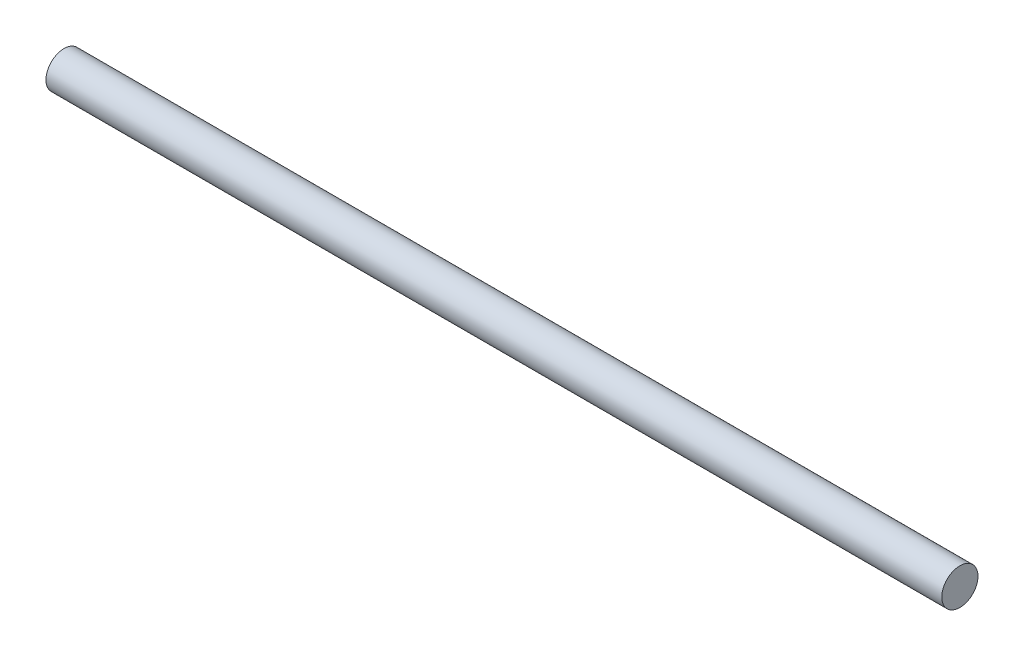
ISO-10303-21;
HEADER;
FILE_DESCRIPTION(('STEP AP214'),'2;1');
FILE_NAME('part.step','',(''),(''),'','','');
FILE_SCHEMA(('AUTOMOTIVE_DESIGN { 1 0 10303 214 1 1 1 1 }'));
ENDSEC;
DATA;
#1=APPLICATION_CONTEXT('core data for automotive mechanical design processes');
#2=APPLICATION_PROTOCOL_DEFINITION('international standard','automotive_design',2000,#1);
#3=PRODUCT_CONTEXT('',#1,'mechanical');
#4=PRODUCT('Part','Part','',(#3));
#5=PRODUCT_RELATED_PRODUCT_CATEGORY('part','',(#4));
#6=PRODUCT_DEFINITION_FORMATION('','',#4);
#7=PRODUCT_DEFINITION_CONTEXT('part definition',#1,'design');
#8=PRODUCT_DEFINITION('design','',#6,#7);
#9=PRODUCT_DEFINITION_SHAPE('','',#8);
#10=(LENGTH_UNIT() NAMED_UNIT(*) SI_UNIT(.MILLI.,.METRE.));
#11=(NAMED_UNIT(*) PLANE_ANGLE_UNIT() SI_UNIT($,.RADIAN.));
#12=(NAMED_UNIT(*) SI_UNIT($,.STERADIAN.) SOLID_ANGLE_UNIT());
#13=UNCERTAINTY_MEASURE_WITH_UNIT(LENGTH_MEASURE(1.E-05),#10,'distance_accuracy_value','');
#14=(GEOMETRIC_REPRESENTATION_CONTEXT(3) GLOBAL_UNCERTAINTY_ASSIGNED_CONTEXT((#13)) GLOBAL_UNIT_ASSIGNED_CONTEXT((#10,
#11,#12)) REPRESENTATION_CONTEXT('',''));
#15=CARTESIAN_POINT('',(0.,0.,0.));
#16=DIRECTION('',(0.,0.,1.));
#17=DIRECTION('',(1.,0.,0.));
#18=AXIS2_PLACEMENT_3D('',#15,#16,#17);
#19=CARTESIAN_POINT('',(14.45,0.,0.));
#20=DIRECTION('',(-1.,0.,0.));
#21=DIRECTION('',(0.,0.,1.));
#22=AXIS2_PLACEMENT_3D('',#19,#20,#21);
#23=CYLINDRICAL_SURFACE('',#22,0.2921);
#24=CARTESIAN_POINT('',(14.45,0.,0.));
#25=DIRECTION('',(1.,0.,0.));
#26=DIRECTION('',(0.,0.,-1.));
#27=AXIS2_PLACEMENT_3D('',#24,#25,#26);
#28=CIRCLE('',#27,0.2921);
#29=CARTESIAN_POINT('',(14.45,0.,-0.2921));
#30=VERTEX_POINT('',#29);
#31=EDGE_CURVE('E10',#30,#30,#28,.T.);
#32=ORIENTED_EDGE('',*,*,#31,.F.);
#33=EDGE_LOOP('',(#32));
#34=FACE_BOUND('',#33,.T.);
#35=CARTESIAN_POINT('',(0.,0.,0.));
#36=DIRECTION('',(1.,0.,0.));
#37=DIRECTION('',(0.,0.,-1.));
#38=AXIS2_PLACEMENT_3D('',#35,#36,#37);
#39=CIRCLE('',#38,0.2921);
#40=CARTESIAN_POINT('',(0.,0.,-0.2921));
#41=VERTEX_POINT('',#40);
#42=EDGE_CURVE('E34',#41,#41,#39,.T.);
#43=ORIENTED_EDGE('',*,*,#42,.T.);
#44=EDGE_LOOP('',(#43));
#45=FACE_BOUND('',#44,.T.);
#46=ADVANCED_FACE('F31',(#34,#45),#23,.T.);
#47=CARTESIAN_POINT('',(14.45,0.,0.));
#48=DIRECTION('',(1.,0.,0.));
#49=DIRECTION('',(0.,0.,-1.));
#50=AXIS2_PLACEMENT_3D('',#47,#48,#49);
#51=PLANE('',#50);
#52=ORIENTED_EDGE('',*,*,#31,.T.);
#53=EDGE_LOOP('',(#52));
#54=FACE_BOUND('',#53,.T.);
#55=ADVANCED_FACE('F46',(#54),#51,.T.);
#56=CARTESIAN_POINT('',(0.,0.,0.));
#57=DIRECTION('',(1.,0.,0.));
#58=DIRECTION('',(0.,0.,-1.));
#59=AXIS2_PLACEMENT_3D('',#56,#57,#58);
#60=PLANE('',#59);
#61=ORIENTED_EDGE('',*,*,#42,.F.);
#62=EDGE_LOOP('',(#61));
#63=FACE_BOUND('',#62,.T.);
#64=ADVANCED_FACE('F44',(#63),#60,.F.);
#65=CLOSED_SHELL('',(#46,#55,#64));
#66=MANIFOLD_SOLID_BREP('B2',#65);
#67=ADVANCED_BREP_SHAPE_REPRESENTATION('',(#18,#66),#14);
#68=SHAPE_DEFINITION_REPRESENTATION(#9,#67);
ENDSEC;
END-ISO-10303-21;
